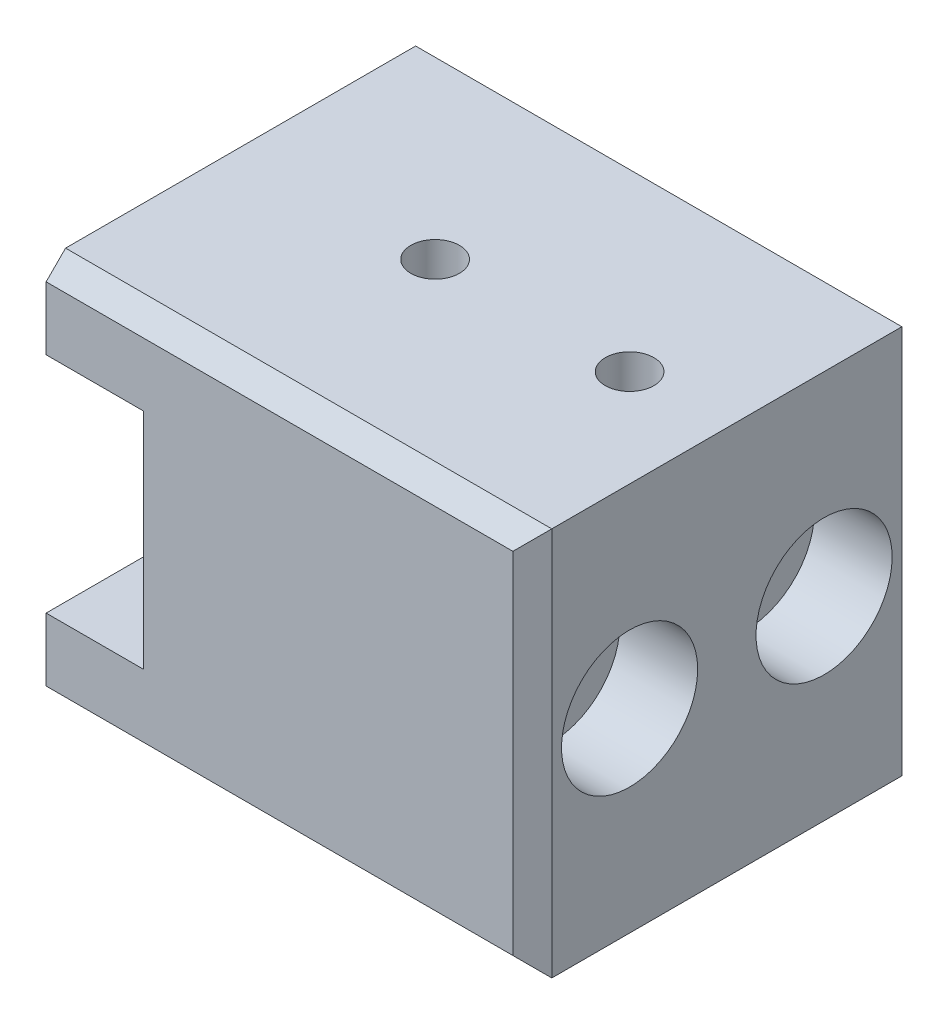
ISO-10303-21;
HEADER;
FILE_DESCRIPTION(('STEP AP214'),'2;1');
FILE_NAME('part.step','',(''),(''),'','','');
FILE_SCHEMA(('AUTOMOTIVE_DESIGN { 1 0 10303 214 1 1 1 1 }'));
ENDSEC;
DATA;
#1=APPLICATION_CONTEXT('core data for automotive mechanical design processes');
#2=APPLICATION_PROTOCOL_DEFINITION('international standard','automotive_design',2000,#1);
#3=PRODUCT_CONTEXT('',#1,'mechanical');
#4=PRODUCT('Part','Part','',(#3));
#5=PRODUCT_RELATED_PRODUCT_CATEGORY('part','',(#4));
#6=PRODUCT_DEFINITION_FORMATION('','',#4);
#7=PRODUCT_DEFINITION_CONTEXT('part definition',#1,'design');
#8=PRODUCT_DEFINITION('design','',#6,#7);
#9=PRODUCT_DEFINITION_SHAPE('','',#8);
#10=(LENGTH_UNIT() NAMED_UNIT(*) SI_UNIT(.MILLI.,.METRE.));
#11=(NAMED_UNIT(*) PLANE_ANGLE_UNIT() SI_UNIT($,.RADIAN.));
#12=(NAMED_UNIT(*) SI_UNIT($,.STERADIAN.) SOLID_ANGLE_UNIT());
#13=UNCERTAINTY_MEASURE_WITH_UNIT(LENGTH_MEASURE(1.E-05),#10,'distance_accuracy_value','');
#14=(GEOMETRIC_REPRESENTATION_CONTEXT(3) GLOBAL_UNCERTAINTY_ASSIGNED_CONTEXT((#13)) GLOBAL_UNIT_ASSIGNED_CONTEXT((#10,
#11,#12)) REPRESENTATION_CONTEXT('',''));
#15=CARTESIAN_POINT('',(0.,0.,0.));
#16=DIRECTION('',(0.,0.,1.));
#17=DIRECTION('',(1.,0.,0.));
#18=AXIS2_PLACEMENT_3D('',#15,#16,#17);
#19=CARTESIAN_POINT('',(25.,0.,-5.));
#20=DIRECTION('',(-1.,0.,0.));
#21=DIRECTION('',(0.,0.,1.));
#22=AXIS2_PLACEMENT_3D('',#19,#20,#21);
#23=CYLINDRICAL_SURFACE('',#22,1.25);
#24=CARTESIAN_POINT('',(5.,0.,-5.));
#25=DIRECTION('',(-1.,0.,0.));
#26=DIRECTION('',(0.,0.,1.));
#27=AXIS2_PLACEMENT_3D('',#24,#25,#26);
#28=CIRCLE('',#27,1.25);
#29=CARTESIAN_POINT('',(5.,0.,-3.75));
#30=VERTEX_POINT('',#29);
#31=EDGE_CURVE('E278',#30,#30,#28,.T.);
#32=ORIENTED_EDGE('',*,*,#31,.T.);
#33=EDGE_LOOP('',(#32));
#34=FACE_BOUND('',#33,.T.);
#35=CARTESIAN_POINT('',(21.,0.,-5.));
#36=DIRECTION('',(1.,0.,0.));
#37=DIRECTION('',(0.,0.,-1.));
#38=AXIS2_PLACEMENT_3D('',#35,#36,#37);
#39=CIRCLE('',#38,1.25);
#40=CARTESIAN_POINT('',(21.,0.,-6.25));
#41=VERTEX_POINT('',#40);
#42=EDGE_CURVE('E43',#41,#41,#39,.F.);
#43=ORIENTED_EDGE('',*,*,#42,.F.);
#44=EDGE_LOOP('',(#43));
#45=FACE_BOUND('',#44,.T.);
#46=ADVANCED_FACE('F39',(#34,#45),#23,.F.);
#47=CARTESIAN_POINT('',(25.,0.,5.));
#48=DIRECTION('',(-1.,0.,0.));
#49=DIRECTION('',(0.,0.,1.));
#50=AXIS2_PLACEMENT_3D('',#47,#48,#49);
#51=CYLINDRICAL_SURFACE('',#50,1.25);
#52=CARTESIAN_POINT('',(5.,0.,5.));
#53=DIRECTION('',(-1.,0.,0.));
#54=DIRECTION('',(0.,0.,1.));
#55=AXIS2_PLACEMENT_3D('',#52,#53,#54);
#56=CIRCLE('',#55,1.25);
#57=CARTESIAN_POINT('',(5.,0.,6.25));
#58=VERTEX_POINT('',#57);
#59=EDGE_CURVE('E290',#58,#58,#56,.T.);
#60=ORIENTED_EDGE('',*,*,#59,.T.);
#61=EDGE_LOOP('',(#60));
#62=FACE_BOUND('',#61,.T.);
#63=CARTESIAN_POINT('',(21.,0.,5.));
#64=DIRECTION('',(1.,0.,0.));
#65=DIRECTION('',(0.,0.,-1.));
#66=AXIS2_PLACEMENT_3D('',#63,#64,#65);
#67=CIRCLE('',#66,1.25);
#68=CARTESIAN_POINT('',(21.,0.,3.75));
#69=VERTEX_POINT('',#68);
#70=EDGE_CURVE('E248',#69,#69,#67,.F.);
#71=ORIENTED_EDGE('',*,*,#70,.F.);
#72=EDGE_LOOP('',(#71));
#73=FACE_BOUND('',#72,.T.);
#74=ADVANCED_FACE('F366',(#62,#73),#51,.F.);
#75=CARTESIAN_POINT('',(0.,0.,0.));
#76=DIRECTION('',(1.,0.,0.));
#77=DIRECTION('',(0.,0.,-1.));
#78=AXIS2_PLACEMENT_3D('',#75,#76,#77);
#79=PLANE('',#78);
#80=DIRECTION('',(0.,0.,1.));
#81=VECTOR('',#80,1.);
#82=CARTESIAN_POINT('',(0.,10.,-10.));
#83=LINE('',#82,#81);
#84=CARTESIAN_POINT('',(0.,10.,-9.00000000000001));
#85=VERTEX_POINT('',#84);
#86=CARTESIAN_POINT('',(0.,10.,9.));
#87=VERTEX_POINT('',#86);
#88=EDGE_CURVE('E169',#85,#87,#83,.T.);
#89=ORIENTED_EDGE('',*,*,#88,.F.);
#90=DIRECTION('',(0.,0.707106781186549,0.707106781186546));
#91=VECTOR('',#90,1.);
#92=CARTESIAN_POINT('',(0.,10.,-9.00000000000001));
#93=LINE('',#92,#91);
#94=CARTESIAN_POINT('',(0.,9.,-10.));
#95=VERTEX_POINT('',#94);
#96=EDGE_CURVE('E224',#85,#95,#93,.F.);
#97=ORIENTED_EDGE('',*,*,#96,.T.);
#98=DIRECTION('',(0.,1.,0.));
#99=VECTOR('',#98,1.);
#100=CARTESIAN_POINT('',(0.,-10.,-10.));
#101=LINE('',#100,#99);
#102=CARTESIAN_POINT('',(0.,5.75,-10.));
#103=VERTEX_POINT('',#102);
#104=EDGE_CURVE('E182',#103,#95,#101,.T.);
#105=ORIENTED_EDGE('',*,*,#104,.F.);
#106=DIRECTION('',(0.,0.,-1.));
#107=VECTOR('',#106,1.);
#108=CARTESIAN_POINT('',(0.,5.75,10.));
#109=LINE('',#108,#107);
#110=CARTESIAN_POINT('',(0.,5.75,10.));
#111=VERTEX_POINT('',#110);
#112=EDGE_CURVE('E149',#111,#103,#109,.T.);
#113=ORIENTED_EDGE('',*,*,#112,.F.);
#114=DIRECTION('',(0.,-1.,0.));
#115=VECTOR('',#114,1.);
#116=CARTESIAN_POINT('',(0.,-10.,10.));
#117=LINE('',#116,#115);
#118=CARTESIAN_POINT('',(0.,9.,10.));
#119=VERTEX_POINT('',#118);
#120=EDGE_CURVE('E174',#119,#111,#117,.T.);
#121=ORIENTED_EDGE('',*,*,#120,.F.);
#122=DIRECTION('',(0.,-0.707106781186546,0.707106781186549));
#123=VECTOR('',#122,1.);
#124=CARTESIAN_POINT('',(0.,9.,10.));
#125=LINE('',#124,#123);
#126=EDGE_CURVE('E221',#119,#87,#125,.F.);
#127=ORIENTED_EDGE('',*,*,#126,.T.);
#128=EDGE_LOOP('',(#89,#97,#105,#113,#121,#127));
#129=FACE_BOUND('',#128,.T.);
#130=ADVANCED_FACE('F316',(#129),#79,.F.);
#131=CARTESIAN_POINT('',(25.,-10.,10.));
#132=DIRECTION('',(0.,0.,-1.));
#133=DIRECTION('',(-1.,0.,0.));
#134=AXIS2_PLACEMENT_3D('',#131,#132,#133);
#135=PLANE('',#134);
#136=CARTESIAN_POINT('',(0.,-5.75,10.));
#137=VERTEX_POINT('',#136);
#138=CARTESIAN_POINT('',(0.,-9.00000000000001,10.));
#139=VERTEX_POINT('',#138);
#140=EDGE_CURVE('E178',#137,#139,#117,.T.);
#141=ORIENTED_EDGE('',*,*,#140,.T.);
#142=DIRECTION('',(1.,0.,0.));
#143=VECTOR('',#142,1.);
#144=CARTESIAN_POINT('',(25.,-9.00000000000001,10.));
#145=LINE('',#144,#143);
#146=CARTESIAN_POINT('',(24.,-9.00000000000001,10.));
#147=VERTEX_POINT('',#146);
#148=EDGE_CURVE('E11',#139,#147,#145,.T.);
#149=ORIENTED_EDGE('',*,*,#148,.T.);
#150=DIRECTION('',(0.,1.,0.));
#151=VECTOR('',#150,1.);
#152=CARTESIAN_POINT('',(24.,10.,10.));
#153=LINE('',#152,#151);
#154=CARTESIAN_POINT('',(24.,9.,10.));
#155=VERTEX_POINT('',#154);
#156=EDGE_CURVE('E49',#147,#155,#153,.T.);
#157=ORIENTED_EDGE('',*,*,#156,.T.);
#158=DIRECTION('',(-1.,0.,0.));
#159=VECTOR('',#158,1.);
#160=CARTESIAN_POINT('',(25.,9.,10.));
#161=LINE('',#160,#159);
#162=EDGE_CURVE('E227',#155,#119,#161,.T.);
#163=ORIENTED_EDGE('',*,*,#162,.T.);
#164=ORIENTED_EDGE('',*,*,#120,.T.);
#165=DIRECTION('',(-1.,0.,0.));
#166=VECTOR('',#165,1.);
#167=CARTESIAN_POINT('',(5.,5.75,10.));
#168=LINE('',#167,#166);
#169=CARTESIAN_POINT('',(5.,5.75,10.));
#170=VERTEX_POINT('',#169);
#171=EDGE_CURVE('E159',#170,#111,#168,.T.);
#172=ORIENTED_EDGE('',*,*,#171,.F.);
#173=DIRECTION('',(0.,1.,0.));
#174=VECTOR('',#173,1.);
#175=CARTESIAN_POINT('',(5.,-5.75,10.));
#176=LINE('',#175,#174);
#177=CARTESIAN_POINT('',(5.,-5.75,10.));
#178=VERTEX_POINT('',#177);
#179=EDGE_CURVE('E138',#178,#170,#176,.T.);
#180=ORIENTED_EDGE('',*,*,#179,.F.);
#181=DIRECTION('',(-1.,0.,0.));
#182=VECTOR('',#181,1.);
#183=CARTESIAN_POINT('',(5.,-5.75,10.));
#184=LINE('',#183,#182);
#185=EDGE_CURVE('E134',#178,#137,#184,.T.);
#186=ORIENTED_EDGE('',*,*,#185,.T.);
#187=EDGE_LOOP('',(#141,#149,#157,#163,#164,#172,#180,#186));
#188=FACE_BOUND('',#187,.T.);
#189=ADVANCED_FACE('F324',(#188),#135,.F.);
#190=CARTESIAN_POINT('',(25.,-10.,-10.));
#191=DIRECTION('',(0.,1.,0.));
#192=DIRECTION('',(0.,0.,1.));
#193=AXIS2_PLACEMENT_3D('',#190,#191,#192);
#194=PLANE('',#193);
#195=CARTESIAN_POINT('',(20.,-10.,0.));
#196=DIRECTION('',(0.,1.,0.));
#197=DIRECTION('',(0.,0.,1.));
#198=AXIS2_PLACEMENT_3D('',#195,#196,#197);
#199=CIRCLE('',#198,1.25);
#200=CARTESIAN_POINT('',(20.,-10.,1.25));
#201=VERTEX_POINT('',#200);
#202=EDGE_CURVE('E274',#201,#201,#199,.T.);
#203=ORIENTED_EDGE('',*,*,#202,.T.);
#204=EDGE_LOOP('',(#203));
#205=FACE_BOUND('',#204,.T.);
#206=CARTESIAN_POINT('',(10.,-10.,0.));
#207=DIRECTION('',(0.,1.,0.));
#208=DIRECTION('',(0.,0.,1.));
#209=AXIS2_PLACEMENT_3D('',#206,#207,#208);
#210=CIRCLE('',#209,1.25);
#211=CARTESIAN_POINT('',(10.,-10.,1.25));
#212=VERTEX_POINT('',#211);
#213=EDGE_CURVE('E283',#212,#212,#210,.T.);
#214=ORIENTED_EDGE('',*,*,#213,.T.);
#215=EDGE_LOOP('',(#214));
#216=FACE_BOUND('',#215,.T.);
#217=DIRECTION('',(0.,0.,-1.));
#218=VECTOR('',#217,1.);
#219=CARTESIAN_POINT('',(0.,-10.,-10.));
#220=LINE('',#219,#218);
#221=CARTESIAN_POINT('',(0.,-10.,9.));
#222=VERTEX_POINT('',#221);
#223=CARTESIAN_POINT('',(0.,-10.,-9.00000000000001));
#224=VERTEX_POINT('',#223);
#225=EDGE_CURVE('E177',#222,#224,#220,.T.);
#226=ORIENTED_EDGE('',*,*,#225,.T.);
#227=DIRECTION('',(1.,0.,0.));
#228=VECTOR('',#227,1.);
#229=CARTESIAN_POINT('',(25.,-10.,-9.00000000000001));
#230=LINE('',#229,#228);
#231=CARTESIAN_POINT('',(25.,-10.,-9.00000000000001));
#232=VERTEX_POINT('',#231);
#233=EDGE_CURVE('E206',#224,#232,#230,.T.);
#234=ORIENTED_EDGE('',*,*,#233,.T.);
#235=DIRECTION('',(0.,0.,-1.));
#236=VECTOR('',#235,1.);
#237=CARTESIAN_POINT('',(25.,-10.,-10.));
#238=LINE('',#237,#236);
#239=CARTESIAN_POINT('',(25.,-10.,9.));
#240=VERTEX_POINT('',#239);
#241=EDGE_CURVE('E164',#240,#232,#238,.T.);
#242=ORIENTED_EDGE('',*,*,#241,.F.);
#243=DIRECTION('',(-1.,0.,0.));
#244=VECTOR('',#243,1.);
#245=CARTESIAN_POINT('',(25.,-10.,9.));
#246=LINE('',#245,#244);
#247=EDGE_CURVE('E202',#240,#222,#246,.T.);
#248=ORIENTED_EDGE('',*,*,#247,.T.);
#249=EDGE_LOOP('',(#226,#234,#242,#248));
#250=FACE_BOUND('',#249,.T.);
#251=ADVANCED_FACE('F354',(#205,#216,#250),#194,.F.);
#252=CARTESIAN_POINT('',(25.,-10.,-10.));
#253=DIRECTION('',(0.,0.,1.));
#254=DIRECTION('',(1.,0.,0.));
#255=AXIS2_PLACEMENT_3D('',#252,#253,#254);
#256=PLANE('',#255);
#257=DIRECTION('',(0.,-1.,0.));
#258=VECTOR('',#257,1.);
#259=CARTESIAN_POINT('',(24.,-10.,-10.));
#260=LINE('',#259,#258);
#261=CARTESIAN_POINT('',(24.,9.,-10.));
#262=VERTEX_POINT('',#261);
#263=CARTESIAN_POINT('',(24.,-9.00000000000001,-10.));
#264=VERTEX_POINT('',#263);
#265=EDGE_CURVE('E190',#262,#264,#260,.T.);
#266=ORIENTED_EDGE('',*,*,#265,.T.);
#267=DIRECTION('',(-1.,0.,0.));
#268=VECTOR('',#267,1.);
#269=CARTESIAN_POINT('',(25.,-9.00000000000001,-10.));
#270=LINE('',#269,#268);
#271=CARTESIAN_POINT('',(0.,-9.00000000000001,-10.));
#272=VERTEX_POINT('',#271);
#273=EDGE_CURVE('E193',#264,#272,#270,.T.);
#274=ORIENTED_EDGE('',*,*,#273,.T.);
#275=CARTESIAN_POINT('',(0.,-5.75,-10.));
#276=VERTEX_POINT('',#275);
#277=EDGE_CURVE('E154',#272,#276,#101,.T.);
#278=ORIENTED_EDGE('',*,*,#277,.T.);
#279=DIRECTION('',(-1.,0.,0.));
#280=VECTOR('',#279,1.);
#281=CARTESIAN_POINT('',(5.,-5.75,-10.));
#282=LINE('',#281,#280);
#283=CARTESIAN_POINT('',(5.,-5.75,-10.));
#284=VERTEX_POINT('',#283);
#285=EDGE_CURVE('E131',#284,#276,#282,.T.);
#286=ORIENTED_EDGE('',*,*,#285,.F.);
#287=DIRECTION('',(0.,-1.,0.));
#288=VECTOR('',#287,1.);
#289=CARTESIAN_POINT('',(5.,-5.75,-10.));
#290=LINE('',#289,#288);
#291=CARTESIAN_POINT('',(5.,5.75,-10.));
#292=VERTEX_POINT('',#291);
#293=EDGE_CURVE('E139',#292,#284,#290,.T.);
#294=ORIENTED_EDGE('',*,*,#293,.F.);
#295=DIRECTION('',(-1.,0.,0.));
#296=VECTOR('',#295,1.);
#297=CARTESIAN_POINT('',(5.,5.75,-10.));
#298=LINE('',#297,#296);
#299=EDGE_CURVE('E304',#292,#103,#298,.T.);
#300=ORIENTED_EDGE('',*,*,#299,.T.);
#301=ORIENTED_EDGE('',*,*,#104,.T.);
#302=DIRECTION('',(1.,0.,0.));
#303=VECTOR('',#302,1.);
#304=CARTESIAN_POINT('',(25.,9.,-10.));
#305=LINE('',#304,#303);
#306=EDGE_CURVE('E173',#95,#262,#305,.T.);
#307=ORIENTED_EDGE('',*,*,#306,.T.);
#308=EDGE_LOOP('',(#266,#274,#278,#286,#294,#300,#301,#307));
#309=FACE_BOUND('',#308,.T.);
#310=ADVANCED_FACE('F151',(#309),#256,.F.);
#311=CARTESIAN_POINT('',(25.,10.,-10.));
#312=DIRECTION('',(0.,-1.,0.));
#313=DIRECTION('',(0.,0.,-1.));
#314=AXIS2_PLACEMENT_3D('',#311,#312,#313);
#315=PLANE('',#314);
#316=CARTESIAN_POINT('',(20.,10.,0.));
#317=DIRECTION('',(0.,1.,0.));
#318=DIRECTION('',(0.,0.,1.));
#319=AXIS2_PLACEMENT_3D('',#316,#317,#318);
#320=CIRCLE('',#319,1.25);
#321=CARTESIAN_POINT('',(20.,10.,1.25));
#322=VERTEX_POINT('',#321);
#323=EDGE_CURVE('E279',#322,#322,#320,.T.);
#324=ORIENTED_EDGE('',*,*,#323,.F.);
#325=EDGE_LOOP('',(#324));
#326=FACE_BOUND('',#325,.T.);
#327=CARTESIAN_POINT('',(10.,10.,0.));
#328=DIRECTION('',(0.,1.,0.));
#329=DIRECTION('',(0.,0.,1.));
#330=AXIS2_PLACEMENT_3D('',#327,#328,#329);
#331=CIRCLE('',#330,1.25);
#332=CARTESIAN_POINT('',(10.,10.,1.25));
#333=VERTEX_POINT('',#332);
#334=EDGE_CURVE('E241',#333,#333,#331,.T.);
#335=ORIENTED_EDGE('',*,*,#334,.F.);
#336=EDGE_LOOP('',(#335));
#337=FACE_BOUND('',#336,.T.);
#338=DIRECTION('',(0.,0.,1.));
#339=VECTOR('',#338,1.);
#340=CARTESIAN_POINT('',(25.,10.,-10.));
#341=LINE('',#340,#339);
#342=CARTESIAN_POINT('',(25.,10.,-9.00000000000001));
#343=VERTEX_POINT('',#342);
#344=CARTESIAN_POINT('',(25.,10.,9.));
#345=VERTEX_POINT('',#344);
#346=EDGE_CURVE('E168',#343,#345,#341,.T.);
#347=ORIENTED_EDGE('',*,*,#346,.F.);
#348=DIRECTION('',(-1.,0.,0.));
#349=VECTOR('',#348,1.);
#350=CARTESIAN_POINT('',(25.,10.,-9.00000000000001));
#351=LINE('',#350,#349);
#352=EDGE_CURVE('E218',#343,#85,#351,.T.);
#353=ORIENTED_EDGE('',*,*,#352,.T.);
#354=ORIENTED_EDGE('',*,*,#88,.T.);
#355=DIRECTION('',(1.,0.,0.));
#356=VECTOR('',#355,1.);
#357=CARTESIAN_POINT('',(25.,10.,9.));
#358=LINE('',#357,#356);
#359=EDGE_CURVE('E215',#87,#345,#358,.T.);
#360=ORIENTED_EDGE('',*,*,#359,.T.);
#361=EDGE_LOOP('',(#347,#353,#354,#360));
#362=FACE_BOUND('',#361,.T.);
#363=ADVANCED_FACE('F338',(#326,#337,#362),#315,.F.);
#364=CARTESIAN_POINT('',(25.,0.,0.));
#365=DIRECTION('',(1.,0.,0.));
#366=DIRECTION('',(0.,0.,-1.));
#367=AXIS2_PLACEMENT_3D('',#364,#365,#366);
#368=PLANE('',#367);
#369=CARTESIAN_POINT('',(25.,0.,5.));
#370=DIRECTION('',(1.,0.,0.));
#371=DIRECTION('',(0.,0.,-1.));
#372=AXIS2_PLACEMENT_3D('',#369,#370,#371);
#373=CIRCLE('',#372,3.5);
#374=CARTESIAN_POINT('',(25.,0.,1.5));
#375=VERTEX_POINT('',#374);
#376=EDGE_CURVE('E258',#375,#375,#373,.T.);
#377=ORIENTED_EDGE('',*,*,#376,.F.);
#378=EDGE_LOOP('',(#377));
#379=FACE_BOUND('',#378,.T.);
#380=CARTESIAN_POINT('',(25.,0.,-5.));
#381=DIRECTION('',(1.,0.,0.));
#382=DIRECTION('',(0.,0.,-1.));
#383=AXIS2_PLACEMENT_3D('',#380,#381,#382);
#384=CIRCLE('',#383,3.5);
#385=CARTESIAN_POINT('',(25.,0.,-8.5));
#386=VERTEX_POINT('',#385);
#387=EDGE_CURVE('E270',#386,#386,#384,.T.);
#388=ORIENTED_EDGE('',*,*,#387,.F.);
#389=EDGE_LOOP('',(#388));
#390=FACE_BOUND('',#389,.T.);
#391=ORIENTED_EDGE('',*,*,#241,.T.);
#392=DIRECTION('',(0.,1.,0.));
#393=VECTOR('',#392,1.);
#394=CARTESIAN_POINT('',(25.,10.,-9.00000000000001));
#395=LINE('',#394,#393);
#396=EDGE_CURVE('E212',#232,#343,#395,.T.);
#397=ORIENTED_EDGE('',*,*,#396,.T.);
#398=ORIENTED_EDGE('',*,*,#346,.T.);
#399=DIRECTION('',(0.,-1.,0.));
#400=VECTOR('',#399,1.);
#401=CARTESIAN_POINT('',(25.,-10.,9.));
#402=LINE('',#401,#400);
#403=EDGE_CURVE('E209',#345,#240,#402,.T.);
#404=ORIENTED_EDGE('',*,*,#403,.T.);
#405=EDGE_LOOP('',(#391,#397,#398,#404));
#406=FACE_BOUND('',#405,.T.);
#407=ADVANCED_FACE('F385',(#379,#390,#406),#368,.T.);
#408=ORIENTED_EDGE('',*,*,#277,.F.);
#409=DIRECTION('',(0.,0.707106781186549,-0.707106781186546));
#410=VECTOR('',#409,1.);
#411=CARTESIAN_POINT('',(0.,-9.00000000000001,-10.));
#412=LINE('',#411,#410);
#413=EDGE_CURVE('E199',#272,#224,#412,.F.);
#414=ORIENTED_EDGE('',*,*,#413,.T.);
#415=ORIENTED_EDGE('',*,*,#225,.F.);
#416=DIRECTION('',(0.,-0.707106781186546,-0.707106781186549));
#417=VECTOR('',#416,1.);
#418=CARTESIAN_POINT('',(0.,-10.,9.));
#419=LINE('',#418,#417);
#420=EDGE_CURVE('E196',#222,#139,#419,.F.);
#421=ORIENTED_EDGE('',*,*,#420,.T.);
#422=ORIENTED_EDGE('',*,*,#140,.F.);
#423=DIRECTION('',(0.,0.,1.));
#424=VECTOR('',#423,1.);
#425=CARTESIAN_POINT('',(0.,-5.75,10.));
#426=LINE('',#425,#424);
#427=EDGE_CURVE('E294',#276,#137,#426,.T.);
#428=ORIENTED_EDGE('',*,*,#427,.F.);
#429=EDGE_LOOP('',(#408,#414,#415,#421,#422,#428));
#430=FACE_BOUND('',#429,.T.);
#431=ADVANCED_FACE('F350',(#430),#79,.F.);
#432=CARTESIAN_POINT('',(5.,5.75,10.));
#433=DIRECTION('',(0.,1.,0.));
#434=DIRECTION('',(0.,0.,1.));
#435=AXIS2_PLACEMENT_3D('',#432,#433,#434);
#436=PLANE('',#435);
#437=ORIENTED_EDGE('',*,*,#112,.T.);
#438=ORIENTED_EDGE('',*,*,#299,.F.);
#439=DIRECTION('',(0.,0.,-1.));
#440=VECTOR('',#439,1.);
#441=CARTESIAN_POINT('',(5.,5.75,10.));
#442=LINE('',#441,#440);
#443=EDGE_CURVE('E145',#170,#292,#442,.T.);
#444=ORIENTED_EDGE('',*,*,#443,.F.);
#445=ORIENTED_EDGE('',*,*,#171,.T.);
#446=EDGE_LOOP('',(#437,#438,#444,#445));
#447=FACE_BOUND('',#446,.T.);
#448=ADVANCED_FACE('F311',(#447),#436,.F.);
#449=CARTESIAN_POINT('',(5.,-5.75,10.));
#450=DIRECTION('',(0.,-1.,0.));
#451=DIRECTION('',(0.,0.,-1.));
#452=AXIS2_PLACEMENT_3D('',#449,#450,#451);
#453=PLANE('',#452);
#454=ORIENTED_EDGE('',*,*,#427,.T.);
#455=ORIENTED_EDGE('',*,*,#185,.F.);
#456=DIRECTION('',(0.,0.,1.));
#457=VECTOR('',#456,1.);
#458=CARTESIAN_POINT('',(5.,-5.75,10.));
#459=LINE('',#458,#457);
#460=EDGE_CURVE('E127',#284,#178,#459,.T.);
#461=ORIENTED_EDGE('',*,*,#460,.F.);
#462=ORIENTED_EDGE('',*,*,#285,.T.);
#463=EDGE_LOOP('',(#454,#455,#461,#462));
#464=FACE_BOUND('',#463,.T.);
#465=ADVANCED_FACE('F129',(#464),#453,.F.);
#466=CARTESIAN_POINT('',(5.,0.,0.));
#467=DIRECTION('',(-1.,0.,0.));
#468=DIRECTION('',(0.,0.,1.));
#469=AXIS2_PLACEMENT_3D('',#466,#467,#468);
#470=PLANE('',#469);
#471=ORIENTED_EDGE('',*,*,#59,.F.);
#472=EDGE_LOOP('',(#471));
#473=FACE_BOUND('',#472,.T.);
#474=ORIENTED_EDGE('',*,*,#31,.F.);
#475=EDGE_LOOP('',(#474));
#476=FACE_BOUND('',#475,.T.);
#477=ORIENTED_EDGE('',*,*,#293,.T.);
#478=ORIENTED_EDGE('',*,*,#460,.T.);
#479=ORIENTED_EDGE('',*,*,#179,.T.);
#480=ORIENTED_EDGE('',*,*,#443,.T.);
#481=EDGE_LOOP('',(#477,#478,#479,#480));
#482=FACE_BOUND('',#481,.T.);
#483=ADVANCED_FACE('F143',(#473,#476,#482),#470,.T.);
#484=CARTESIAN_POINT('',(10.,-10.,0.));
#485=DIRECTION('',(0.,1.,0.));
#486=DIRECTION('',(0.,0.,1.));
#487=AXIS2_PLACEMENT_3D('',#484,#485,#486);
#488=CYLINDRICAL_SURFACE('',#487,1.25);
#489=ORIENTED_EDGE('',*,*,#213,.F.);
#490=EDGE_LOOP('',(#489));
#491=FACE_BOUND('',#490,.T.);
#492=ORIENTED_EDGE('',*,*,#334,.T.);
#493=EDGE_LOOP('',(#492));
#494=FACE_BOUND('',#493,.T.);
#495=ADVANCED_FACE('F379',(#491,#494),#488,.F.);
#496=CARTESIAN_POINT('',(20.,-10.,0.));
#497=DIRECTION('',(0.,1.,0.));
#498=DIRECTION('',(0.,0.,1.));
#499=AXIS2_PLACEMENT_3D('',#496,#497,#498);
#500=CYLINDRICAL_SURFACE('',#499,1.25);
#501=ORIENTED_EDGE('',*,*,#202,.F.);
#502=EDGE_LOOP('',(#501));
#503=FACE_BOUND('',#502,.T.);
#504=ORIENTED_EDGE('',*,*,#323,.T.);
#505=EDGE_LOOP('',(#504));
#506=FACE_BOUND('',#505,.T.);
#507=ADVANCED_FACE('F468',(#503,#506),#500,.F.);
#508=CARTESIAN_POINT('',(25.,10.,-9.00000000000001));
#509=DIRECTION('',(0.,-0.707106781186546,0.707106781186549));
#510=DIRECTION('',(-1.,0.,0.));
#511=AXIS2_PLACEMENT_3D('',#508,#509,#510);
#512=PLANE('',#511);
#513=ORIENTED_EDGE('',*,*,#96,.F.);
#514=ORIENTED_EDGE('',*,*,#352,.F.);
#515=DIRECTION('',(0.577350269189626,0.577350269189626,0.577350269189624));
#516=VECTOR('',#515,1.);
#517=CARTESIAN_POINT('',(25.,10.,-9.00000000000001));
#518=LINE('',#517,#516);
#519=EDGE_CURVE('E236',#262,#343,#518,.T.);
#520=ORIENTED_EDGE('',*,*,#519,.F.);
#521=ORIENTED_EDGE('',*,*,#306,.F.);
#522=EDGE_LOOP('',(#513,#514,#520,#521));
#523=FACE_BOUND('',#522,.T.);
#524=ADVANCED_FACE('F342',(#523),#512,.F.);
#525=CARTESIAN_POINT('',(25.,0.,-9.00000000000001));
#526=DIRECTION('',(0.707106781186546,0.,-0.707106781186549));
#527=DIRECTION('',(0.,-1.,0.));
#528=AXIS2_PLACEMENT_3D('',#525,#526,#527);
#529=PLANE('',#528);
#530=ORIENTED_EDGE('',*,*,#519,.T.);
#531=ORIENTED_EDGE('',*,*,#396,.F.);
#532=DIRECTION('',(0.577350269189626,-0.577350269189626,0.577350269189624));
#533=VECTOR('',#532,1.);
#534=CARTESIAN_POINT('',(21.6666666666667,-6.66666666666666,-12.3333333333333));
#535=LINE('',#534,#533);
#536=EDGE_CURVE('E232',#264,#232,#535,.T.);
#537=ORIENTED_EDGE('',*,*,#536,.F.);
#538=ORIENTED_EDGE('',*,*,#265,.F.);
#539=EDGE_LOOP('',(#530,#531,#537,#538));
#540=FACE_BOUND('',#539,.T.);
#541=ADVANCED_FACE('F346',(#540),#529,.T.);
#542=CARTESIAN_POINT('',(25.,-9.00000000000001,-10.));
#543=DIRECTION('',(0.,0.707106781186546,0.707106781186549));
#544=DIRECTION('',(-1.,0.,0.));
#545=AXIS2_PLACEMENT_3D('',#542,#543,#544);
#546=PLANE('',#545);
#547=ORIENTED_EDGE('',*,*,#536,.T.);
#548=ORIENTED_EDGE('',*,*,#233,.F.);
#549=ORIENTED_EDGE('',*,*,#413,.F.);
#550=ORIENTED_EDGE('',*,*,#273,.F.);
#551=EDGE_LOOP('',(#547,#548,#549,#550));
#552=FACE_BOUND('',#551,.T.);
#553=ADVANCED_FACE('F356',(#552),#546,.F.);
#554=CARTESIAN_POINT('',(25.,9.,10.));
#555=DIRECTION('',(0.,-0.707106781186549,-0.707106781186546));
#556=DIRECTION('',(-1.,0.,0.));
#557=AXIS2_PLACEMENT_3D('',#554,#555,#556);
#558=PLANE('',#557);
#559=ORIENTED_EDGE('',*,*,#126,.F.);
#560=ORIENTED_EDGE('',*,*,#162,.F.);
#561=DIRECTION('',(-0.577350269189625,-0.577350269189625,0.577350269189627));
#562=VECTOR('',#561,1.);
#563=CARTESIAN_POINT('',(24.3333333333333,9.33333333333333,9.66666666666667));
#564=LINE('',#563,#562);
#565=EDGE_CURVE('E237',#345,#155,#564,.T.);
#566=ORIENTED_EDGE('',*,*,#565,.F.);
#567=ORIENTED_EDGE('',*,*,#359,.F.);
#568=EDGE_LOOP('',(#559,#560,#566,#567));
#569=FACE_BOUND('',#568,.T.);
#570=ADVANCED_FACE('F41',(#569),#558,.F.);
#571=CARTESIAN_POINT('',(25.,0.,9.));
#572=DIRECTION('',(0.707106781186549,0.,0.707106781186546));
#573=DIRECTION('',(0.,1.,0.));
#574=AXIS2_PLACEMENT_3D('',#571,#572,#573);
#575=PLANE('',#574);
#576=ORIENTED_EDGE('',*,*,#565,.T.);
#577=ORIENTED_EDGE('',*,*,#156,.F.);
#578=DIRECTION('',(-0.577350269189625,0.577350269189625,0.577350269189627));
#579=VECTOR('',#578,1.);
#580=CARTESIAN_POINT('',(21.6666666666667,-6.66666666666668,12.3333333333333));
#581=LINE('',#580,#579);
#582=EDGE_CURVE('E242',#240,#147,#581,.T.);
#583=ORIENTED_EDGE('',*,*,#582,.F.);
#584=ORIENTED_EDGE('',*,*,#403,.F.);
#585=EDGE_LOOP('',(#576,#577,#583,#584));
#586=FACE_BOUND('',#585,.T.);
#587=ADVANCED_FACE('F332',(#586),#575,.T.);
#588=CARTESIAN_POINT('',(25.,-10.,9.));
#589=DIRECTION('',(0.,0.707106781186549,-0.707106781186546));
#590=DIRECTION('',(-1.,0.,0.));
#591=AXIS2_PLACEMENT_3D('',#588,#589,#590);
#592=PLANE('',#591);
#593=ORIENTED_EDGE('',*,*,#582,.T.);
#594=ORIENTED_EDGE('',*,*,#148,.F.);
#595=ORIENTED_EDGE('',*,*,#420,.F.);
#596=ORIENTED_EDGE('',*,*,#247,.F.);
#597=EDGE_LOOP('',(#593,#594,#595,#596));
#598=FACE_BOUND('',#597,.T.);
#599=ADVANCED_FACE('F327',(#598),#592,.F.);
#600=CARTESIAN_POINT('',(21.,0.,5.));
#601=DIRECTION('',(1.,0.,0.));
#602=DIRECTION('',(0.,0.,-1.));
#603=AXIS2_PLACEMENT_3D('',#600,#601,#602);
#604=PLANE('',#603);
#605=CARTESIAN_POINT('',(21.,0.,5.));
#606=DIRECTION('',(1.,0.,0.));
#607=DIRECTION('',(0.,0.,-1.));
#608=AXIS2_PLACEMENT_3D('',#605,#606,#607);
#609=CIRCLE('',#608,3.5);
#610=CARTESIAN_POINT('',(21.,0.,1.5));
#611=VERTEX_POINT('',#610);
#612=EDGE_CURVE('E251',#611,#611,#609,.T.);
#613=ORIENTED_EDGE('',*,*,#612,.T.);
#614=EDGE_LOOP('',(#613));
#615=FACE_BOUND('',#614,.T.);
#616=ORIENTED_EDGE('',*,*,#70,.T.);
#617=EDGE_LOOP('',(#616));
#618=FACE_BOUND('',#617,.T.);
#619=ADVANCED_FACE('F426',(#615,#618),#604,.T.);
#620=CARTESIAN_POINT('',(21.,0.,5.));
#621=DIRECTION('',(1.,0.,0.));
#622=DIRECTION('',(0.,0.,-1.));
#623=AXIS2_PLACEMENT_3D('',#620,#621,#622);
#624=CYLINDRICAL_SURFACE('',#623,3.5);
#625=ORIENTED_EDGE('',*,*,#612,.F.);
#626=EDGE_LOOP('',(#625));
#627=FACE_BOUND('',#626,.T.);
#628=ORIENTED_EDGE('',*,*,#376,.T.);
#629=EDGE_LOOP('',(#628));
#630=FACE_BOUND('',#629,.T.);
#631=ADVANCED_FACE('F431',(#627,#630),#624,.F.);
#632=CARTESIAN_POINT('',(21.,0.,-5.));
#633=DIRECTION('',(1.,0.,0.));
#634=DIRECTION('',(0.,0.,-1.));
#635=AXIS2_PLACEMENT_3D('',#632,#633,#634);
#636=PLANE('',#635);
#637=CARTESIAN_POINT('',(21.,0.,-5.));
#638=DIRECTION('',(1.,0.,0.));
#639=DIRECTION('',(0.,0.,-1.));
#640=AXIS2_PLACEMENT_3D('',#637,#638,#639);
#641=CIRCLE('',#640,3.5);
#642=CARTESIAN_POINT('',(21.,0.,-8.5));
#643=VERTEX_POINT('',#642);
#644=EDGE_CURVE('E264',#643,#643,#641,.T.);
#645=ORIENTED_EDGE('',*,*,#644,.T.);
#646=EDGE_LOOP('',(#645));
#647=FACE_BOUND('',#646,.T.);
#648=ORIENTED_EDGE('',*,*,#42,.T.);
#649=EDGE_LOOP('',(#648));
#650=FACE_BOUND('',#649,.T.);
#651=ADVANCED_FACE('F441',(#647,#650),#636,.T.);
#652=CARTESIAN_POINT('',(21.,0.,-5.));
#653=DIRECTION('',(1.,0.,0.));
#654=DIRECTION('',(0.,0.,-1.));
#655=AXIS2_PLACEMENT_3D('',#652,#653,#654);
#656=CYLINDRICAL_SURFACE('',#655,3.5);
#657=ORIENTED_EDGE('',*,*,#644,.F.);
#658=EDGE_LOOP('',(#657));
#659=FACE_BOUND('',#658,.T.);
#660=ORIENTED_EDGE('',*,*,#387,.T.);
#661=EDGE_LOOP('',(#660));
#662=FACE_BOUND('',#661,.T.);
#663=ADVANCED_FACE('F451',(#659,#662),#656,.F.);
#664=CLOSED_SHELL('',(#46,#74,#130,#189,#251,#310,#363,#407,#431,#448,#465,#483,#495,#507,#524,
#541,#553,#570,#587,#599,#619,#631,#651,#663));
#665=MANIFOLD_SOLID_BREP('B2',#664);
#666=ADVANCED_BREP_SHAPE_REPRESENTATION('',(#18,#665),#14);
#667=SHAPE_DEFINITION_REPRESENTATION(#9,#666);
ENDSEC;
END-ISO-10303-21;
